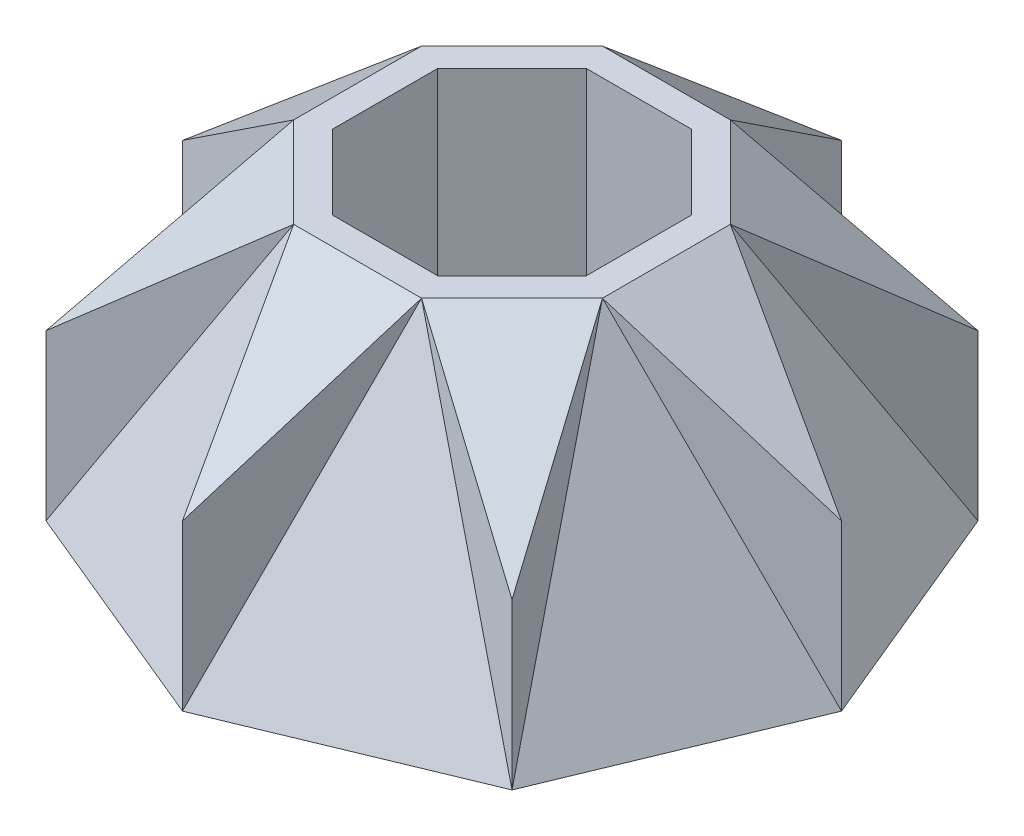
ISO-10303-21;
HEADER;
FILE_DESCRIPTION(('STEP AP214'),'2;1');
FILE_NAME('part.step','',(''),(''),'','','');
FILE_SCHEMA(('AUTOMOTIVE_DESIGN { 1 0 10303 214 1 1 1 1 }'));
ENDSEC;
DATA;
#1=APPLICATION_CONTEXT('core data for automotive mechanical design processes');
#2=APPLICATION_PROTOCOL_DEFINITION('international standard','automotive_design',2000,#1);
#3=PRODUCT_CONTEXT('',#1,'mechanical');
#4=PRODUCT('Part','Part','',(#3));
#5=PRODUCT_RELATED_PRODUCT_CATEGORY('part','',(#4));
#6=PRODUCT_DEFINITION_FORMATION('','',#4);
#7=PRODUCT_DEFINITION_CONTEXT('part definition',#1,'design');
#8=PRODUCT_DEFINITION('design','',#6,#7);
#9=PRODUCT_DEFINITION_SHAPE('','',#8);
#10=(LENGTH_UNIT() NAMED_UNIT(*) SI_UNIT(.MILLI.,.METRE.));
#11=(NAMED_UNIT(*) PLANE_ANGLE_UNIT() SI_UNIT($,.RADIAN.));
#12=(NAMED_UNIT(*) SI_UNIT($,.STERADIAN.) SOLID_ANGLE_UNIT());
#13=UNCERTAINTY_MEASURE_WITH_UNIT(LENGTH_MEASURE(1.E-05),#10,'distance_accuracy_value','');
#14=(GEOMETRIC_REPRESENTATION_CONTEXT(3) GLOBAL_UNCERTAINTY_ASSIGNED_CONTEXT((#13)) GLOBAL_UNIT_ASSIGNED_CONTEXT((#10,
#11,#12)) REPRESENTATION_CONTEXT('',''));
#15=CARTESIAN_POINT('',(0.,0.,0.));
#16=DIRECTION('',(0.,0.,1.));
#17=DIRECTION('',(1.,0.,0.));
#18=AXIS2_PLACEMENT_3D('',#15,#16,#17);
#19=CARTESIAN_POINT('',(0.,55.,0.));
#20=DIRECTION('',(0.,1.,0.));
#21=DIRECTION('',(0.,0.,1.));
#22=AXIS2_PLACEMENT_3D('',#19,#20,#21);
#23=PLANE('',#22);
#24=DIRECTION('',(1.,0.,0.));
#25=VECTOR('',#24,1.);
#26=CARTESIAN_POINT('',(-11.6443685579777,55.0000000000001,28.1119924979396));
#27=LINE('',#26,#25);
#28=CARTESIAN_POINT('',(-11.6443685579777,55.0000000000001,28.1119924979396));
#29=VERTEX_POINT('',#28);
#30=CARTESIAN_POINT('',(11.644368557977,55.,28.1119924979399));
#31=VERTEX_POINT('',#30);
#32=EDGE_CURVE('E176',#29,#31,#27,.T.);
#33=ORIENTED_EDGE('',*,*,#32,.T.);
#34=DIRECTION('',(0.707106781186555,0.,-0.70710678118654));
#35=VECTOR('',#34,1.);
#36=CARTESIAN_POINT('',(11.644368557977,55.0000000000001,28.1119924979399));
#37=LINE('',#36,#35);
#38=CARTESIAN_POINT('',(28.1119924979396,55.,11.6443685579776));
#39=VERTEX_POINT('',#38);
#40=EDGE_CURVE('E211',#31,#39,#37,.T.);
#41=ORIENTED_EDGE('',*,*,#40,.T.);
#42=DIRECTION('',(0.,0.,-1.));
#43=VECTOR('',#42,1.);
#44=CARTESIAN_POINT('',(28.1119924979397,55.0000000000001,11.6443685579774));
#45=LINE('',#44,#43);
#46=CARTESIAN_POINT('',(28.1119924979398,55.,-11.6443685579773));
#47=VERTEX_POINT('',#46);
#48=EDGE_CURVE('E193',#39,#47,#45,.T.);
#49=ORIENTED_EDGE('',*,*,#48,.T.);
#50=DIRECTION('',(-0.707106781186542,0.,-0.707106781186553));
#51=VECTOR('',#50,1.);
#52=CARTESIAN_POINT('',(28.1119924979399,55.0000000000001,-11.6443685579771));
#53=LINE('',#52,#51);
#54=CARTESIAN_POINT('',(11.6443685579776,55.,-28.1119924979397));
#55=VERTEX_POINT('',#54);
#56=EDGE_CURVE('E343',#47,#55,#53,.T.);
#57=ORIENTED_EDGE('',*,*,#56,.T.);
#58=DIRECTION('',(-1.,0.,0.));
#59=VECTOR('',#58,1.);
#60=CARTESIAN_POINT('',(11.6443685579775,55.0000000000001,-28.1119924979397));
#61=LINE('',#60,#59);
#62=CARTESIAN_POINT('',(-11.6443685579772,55.,-28.1119924979398));
#63=VERTEX_POINT('',#62);
#64=EDGE_CURVE('E341',#55,#63,#61,.T.);
#65=ORIENTED_EDGE('',*,*,#64,.T.);
#66=DIRECTION('',(-0.70710678118655,0.,0.707106781186545));
#67=VECTOR('',#66,1.);
#68=CARTESIAN_POINT('',(-11.6443685579772,55.0000000000001,-28.1119924979398));
#69=LINE('',#68,#67);
#70=CARTESIAN_POINT('',(-28.1119924979397,55.,-11.6443685579775));
#71=VERTEX_POINT('',#70);
#72=EDGE_CURVE('E335',#63,#71,#69,.T.);
#73=ORIENTED_EDGE('',*,*,#72,.T.);
#74=DIRECTION('',(0.,0.,1.));
#75=VECTOR('',#74,1.);
#76=CARTESIAN_POINT('',(-28.1119924979397,55.0000000000001,-11.6443685579774));
#77=LINE('',#76,#75);
#78=CARTESIAN_POINT('',(-28.1119924979398,55.,11.6443685579773));
#79=VERTEX_POINT('',#78);
#80=EDGE_CURVE('E204',#71,#79,#77,.T.);
#81=ORIENTED_EDGE('',*,*,#80,.T.);
#82=DIRECTION('',(0.707106781186538,0.,0.707106781186557));
#83=VECTOR('',#82,1.);
#84=CARTESIAN_POINT('',(-28.1119924979399,55.0000000000001,11.6443685579769));
#85=LINE('',#84,#83);
#86=EDGE_CURVE('E199',#79,#29,#85,.T.);
#87=ORIENTED_EDGE('',*,*,#86,.T.);
#88=EDGE_LOOP('',(#33,#41,#49,#57,#65,#73,#81,#87));
#89=FACE_BOUND('',#88,.T.);
#90=DIRECTION('',(0.,0.,-1.));
#91=VECTOR('',#90,1.);
#92=CARTESIAN_POINT('',(23.1119924979397,55.,9.57330074611187));
#93=LINE('',#92,#91);
#94=CARTESIAN_POINT('',(23.1119924979397,55.,9.57330074611187));
#95=VERTEX_POINT('',#94);
#96=CARTESIAN_POINT('',(23.1119924979397,55.,-9.57330074611187));
#97=VERTEX_POINT('',#96);
#98=EDGE_CURVE('E237',#95,#97,#93,.T.);
#99=ORIENTED_EDGE('',*,*,#98,.F.);
#100=DIRECTION('',(0.707106781186547,0.,-0.707106781186548));
#101=VECTOR('',#100,1.);
#102=CARTESIAN_POINT('',(9.57330074611187,55.,23.1119924979397));
#103=LINE('',#102,#101);
#104=CARTESIAN_POINT('',(9.57330074611187,55.,23.1119924979397));
#105=VERTEX_POINT('',#104);
#106=EDGE_CURVE('E235',#105,#95,#103,.T.);
#107=ORIENTED_EDGE('',*,*,#106,.F.);
#108=DIRECTION('',(1.,0.,0.));
#109=VECTOR('',#108,1.);
#110=CARTESIAN_POINT('',(-9.57330074611187,55.,23.1119924979397));
#111=LINE('',#110,#109);
#112=CARTESIAN_POINT('',(-9.57330074611187,55.,23.1119924979397));
#113=VERTEX_POINT('',#112);
#114=EDGE_CURVE('E251',#113,#105,#111,.T.);
#115=ORIENTED_EDGE('',*,*,#114,.F.);
#116=DIRECTION('',(0.707106781186547,0.,0.707106781186548));
#117=VECTOR('',#116,1.);
#118=CARTESIAN_POINT('',(-23.1119924979397,55.,9.57330074611187));
#119=LINE('',#118,#117);
#120=CARTESIAN_POINT('',(-23.1119924979397,55.,9.57330074611187));
#121=VERTEX_POINT('',#120);
#122=EDGE_CURVE('E248',#121,#113,#119,.T.);
#123=ORIENTED_EDGE('',*,*,#122,.F.);
#124=DIRECTION('',(0.,0.,1.));
#125=VECTOR('',#124,1.);
#126=CARTESIAN_POINT('',(-23.1119924979397,55.,-9.57330074611187));
#127=LINE('',#126,#125);
#128=CARTESIAN_POINT('',(-23.1119924979397,55.,-9.57330074611187));
#129=VERTEX_POINT('',#128);
#130=EDGE_CURVE('E246',#129,#121,#127,.T.);
#131=ORIENTED_EDGE('',*,*,#130,.F.);
#132=DIRECTION('',(-0.707106781186547,0.,0.707106781186547));
#133=VECTOR('',#132,1.);
#134=CARTESIAN_POINT('',(-9.57330074611187,55.,-23.1119924979397));
#135=LINE('',#134,#133);
#136=CARTESIAN_POINT('',(-9.57330074611187,55.,-23.1119924979397));
#137=VERTEX_POINT('',#136);
#138=EDGE_CURVE('E244',#137,#129,#135,.T.);
#139=ORIENTED_EDGE('',*,*,#138,.F.);
#140=DIRECTION('',(-1.,0.,0.));
#141=VECTOR('',#140,1.);
#142=CARTESIAN_POINT('',(9.57330074611187,55.,-23.1119924979397));
#143=LINE('',#142,#141);
#144=CARTESIAN_POINT('',(9.57330074611187,55.,-23.1119924979397));
#145=VERTEX_POINT('',#144);
#146=EDGE_CURVE('E242',#145,#137,#143,.T.);
#147=ORIENTED_EDGE('',*,*,#146,.F.);
#148=DIRECTION('',(-0.707106781186547,0.,-0.707106781186547));
#149=VECTOR('',#148,1.);
#150=CARTESIAN_POINT('',(23.1119924979397,55.,-9.57330074611187));
#151=LINE('',#150,#149);
#152=EDGE_CURVE('E240',#97,#145,#151,.T.);
#153=ORIENTED_EDGE('',*,*,#152,.F.);
#154=EDGE_LOOP('',(#99,#107,#115,#123,#131,#139,#147,#153));
#155=FACE_BOUND('',#154,.T.);
#156=ADVANCED_FACE('F41',(#89,#155),#23,.T.);
#157=CARTESIAN_POINT('',(0.,0.,0.));
#158=DIRECTION('',(0.,1.,0.));
#159=DIRECTION('',(0.,0.,1.));
#160=AXIS2_PLACEMENT_3D('',#157,#158,#159);
#161=PLANE('',#160);
#162=DIRECTION('',(0.923879532511287,0.,-0.38268343236509));
#163=VECTOR('',#162,1.);
#164=CARTESIAN_POINT('',(0.,0.,60.0000000000001));
#165=LINE('',#164,#163);
#166=CARTESIAN_POINT('',(-7.04297731246584E-13,0.,60.0000000000001));
#167=VERTEX_POINT('',#166);
#168=CARTESIAN_POINT('',(42.4264068711925,0.,42.4264068711934));
#169=VERTEX_POINT('',#168);
#170=EDGE_CURVE('E293',#167,#169,#165,.T.);
#171=ORIENTED_EDGE('',*,*,#170,.F.);
#172=DIRECTION('',(0.923879532511287,0.,0.38268343236509));
#173=VECTOR('',#172,1.);
#174=CARTESIAN_POINT('',(-42.4264068711929,0.,42.4264068711929));
#175=LINE('',#174,#173);
#176=CARTESIAN_POINT('',(-42.4264068711929,0.,42.4264068711929));
#177=VERTEX_POINT('',#176);
#178=EDGE_CURVE('E225',#177,#167,#175,.T.);
#179=ORIENTED_EDGE('',*,*,#178,.F.);
#180=DIRECTION('',(0.38268343236509,0.,0.923879532511287));
#181=VECTOR('',#180,1.);
#182=CARTESIAN_POINT('',(-60.0000000000001,0.,0.));
#183=LINE('',#182,#181);
#184=CARTESIAN_POINT('',(-60.0000000000001,0.,-1.99080539474728E-13));
#185=VERTEX_POINT('',#184);
#186=EDGE_CURVE('E311',#185,#177,#183,.T.);
#187=ORIENTED_EDGE('',*,*,#186,.F.);
#188=DIRECTION('',(-0.38268343236509,0.,0.923879532511287));
#189=VECTOR('',#188,1.);
#190=CARTESIAN_POINT('',(-42.4264068711929,0.,-42.4264068711929));
#191=LINE('',#190,#189);
#192=CARTESIAN_POINT('',(-42.4264068711928,0.,-42.4264068711931));
#193=VERTEX_POINT('',#192);
#194=EDGE_CURVE('E308',#193,#185,#191,.T.);
#195=ORIENTED_EDGE('',*,*,#194,.F.);
#196=DIRECTION('',(-0.923879532511287,0.,0.38268343236509));
#197=VECTOR('',#196,1.);
#198=CARTESIAN_POINT('',(0.,0.,-60.0000000000001));
#199=LINE('',#198,#197);
#200=CARTESIAN_POINT('',(0.,0.,-60.0000000000001));
#201=VERTEX_POINT('',#200);
#202=EDGE_CURVE('E305',#201,#193,#199,.T.);
#203=ORIENTED_EDGE('',*,*,#202,.F.);
#204=DIRECTION('',(-0.923879532511287,0.,-0.38268343236509));
#205=VECTOR('',#204,1.);
#206=CARTESIAN_POINT('',(42.4264068711929,0.,-42.4264068711929));
#207=LINE('',#206,#205);
#208=CARTESIAN_POINT('',(42.4264068711929,0.,-42.4264068711929));
#209=VERTEX_POINT('',#208);
#210=EDGE_CURVE('E302',#209,#201,#207,.T.);
#211=ORIENTED_EDGE('',*,*,#210,.F.);
#212=DIRECTION('',(-0.38268343236509,0.,-0.923879532511287));
#213=VECTOR('',#212,1.);
#214=CARTESIAN_POINT('',(60.0000000000001,0.,0.));
#215=LINE('',#214,#213);
#216=CARTESIAN_POINT('',(60.0000000000001,0.,4.96130914129367E-13));
#217=VERTEX_POINT('',#216);
#218=EDGE_CURVE('E299',#217,#209,#215,.T.);
#219=ORIENTED_EDGE('',*,*,#218,.F.);
#220=DIRECTION('',(0.38268343236509,0.,-0.923879532511287));
#221=VECTOR('',#220,1.);
#222=CARTESIAN_POINT('',(42.4264068711929,0.,42.4264068711929));
#223=LINE('',#222,#221);
#224=EDGE_CURVE('E296',#169,#217,#223,.T.);
#225=ORIENTED_EDGE('',*,*,#224,.F.);
#226=EDGE_LOOP('',(#171,#179,#187,#195,#203,#211,#219,#225));
#227=FACE_BOUND('',#226,.T.);
#228=DIRECTION('',(0.707106781186547,0.,-0.707106781186548));
#229=VECTOR('',#228,1.);
#230=CARTESIAN_POINT('',(9.57330074611187,0.,23.1119924979397));
#231=LINE('',#230,#229);
#232=CARTESIAN_POINT('',(9.57330074611187,0.,23.1119924979397));
#233=VERTEX_POINT('',#232);
#234=CARTESIAN_POINT('',(23.1119924979397,0.,9.57330074611187));
#235=VERTEX_POINT('',#234);
#236=EDGE_CURVE('E222',#233,#235,#231,.T.);
#237=ORIENTED_EDGE('',*,*,#236,.T.);
#238=DIRECTION('',(0.,0.,-1.));
#239=VECTOR('',#238,1.);
#240=CARTESIAN_POINT('',(23.1119924979397,0.,9.57330074611187));
#241=LINE('',#240,#239);
#242=CARTESIAN_POINT('',(23.1119924979397,0.,-9.57330074611187));
#243=VERTEX_POINT('',#242);
#244=EDGE_CURVE('E256',#235,#243,#241,.T.);
#245=ORIENTED_EDGE('',*,*,#244,.T.);
#246=DIRECTION('',(-0.707106781186547,0.,-0.707106781186547));
#247=VECTOR('',#246,1.);
#248=CARTESIAN_POINT('',(23.1119924979397,0.,-9.57330074611187));
#249=LINE('',#248,#247);
#250=CARTESIAN_POINT('',(9.57330074611187,0.,-23.1119924979397));
#251=VERTEX_POINT('',#250);
#252=EDGE_CURVE('E259',#243,#251,#249,.T.);
#253=ORIENTED_EDGE('',*,*,#252,.T.);
#254=DIRECTION('',(-1.,0.,0.));
#255=VECTOR('',#254,1.);
#256=CARTESIAN_POINT('',(9.57330074611187,0.,-23.1119924979397));
#257=LINE('',#256,#255);
#258=CARTESIAN_POINT('',(-9.57330074611187,0.,-23.1119924979397));
#259=VERTEX_POINT('',#258);
#260=EDGE_CURVE('E262',#251,#259,#257,.T.);
#261=ORIENTED_EDGE('',*,*,#260,.T.);
#262=DIRECTION('',(-0.707106781186547,0.,0.707106781186547));
#263=VECTOR('',#262,1.);
#264=CARTESIAN_POINT('',(-9.57330074611187,0.,-23.1119924979397));
#265=LINE('',#264,#263);
#266=CARTESIAN_POINT('',(-23.1119924979397,0.,-9.57330074611187));
#267=VERTEX_POINT('',#266);
#268=EDGE_CURVE('E265',#259,#267,#265,.T.);
#269=ORIENTED_EDGE('',*,*,#268,.T.);
#270=DIRECTION('',(0.,0.,1.));
#271=VECTOR('',#270,1.);
#272=CARTESIAN_POINT('',(-23.1119924979397,0.,-9.57330074611187));
#273=LINE('',#272,#271);
#274=CARTESIAN_POINT('',(-23.1119924979397,0.,9.57330074611187));
#275=VERTEX_POINT('',#274);
#276=EDGE_CURVE('E268',#267,#275,#273,.T.);
#277=ORIENTED_EDGE('',*,*,#276,.T.);
#278=DIRECTION('',(0.707106781186547,0.,0.707106781186548));
#279=VECTOR('',#278,1.);
#280=CARTESIAN_POINT('',(-23.1119924979397,0.,9.57330074611187));
#281=LINE('',#280,#279);
#282=CARTESIAN_POINT('',(-9.57330074611187,0.,23.1119924979397));
#283=VERTEX_POINT('',#282);
#284=EDGE_CURVE('E271',#275,#283,#281,.T.);
#285=ORIENTED_EDGE('',*,*,#284,.T.);
#286=DIRECTION('',(1.,0.,0.));
#287=VECTOR('',#286,1.);
#288=CARTESIAN_POINT('',(-9.57330074611187,0.,23.1119924979397));
#289=LINE('',#288,#287);
#290=EDGE_CURVE('E238',#283,#233,#289,.T.);
#291=ORIENTED_EDGE('',*,*,#290,.T.);
#292=EDGE_LOOP('',(#237,#245,#253,#261,#269,#277,#285,#291));
#293=FACE_BOUND('',#292,.T.);
#294=ADVANCED_FACE('F43',(#227,#293),#161,.F.);
#295=CARTESIAN_POINT('',(9.57330074611187,55.,23.1119924979397));
#296=DIRECTION('',(-0.707106781186548,0.,-0.707106781186547));
#297=DIRECTION('',(-0.707106781186547,0.,0.707106781186548));
#298=AXIS2_PLACEMENT_3D('',#295,#296,#297);
#299=PLANE('',#298);
#300=ORIENTED_EDGE('',*,*,#236,.F.);
#301=DIRECTION('',(0.,-1.,0.));
#302=VECTOR('',#301,1.);
#303=CARTESIAN_POINT('',(9.57330074611187,55.,23.1119924979397));
#304=LINE('',#303,#302);
#305=EDGE_CURVE('E253',#105,#233,#304,.T.);
#306=ORIENTED_EDGE('',*,*,#305,.F.);
#307=ORIENTED_EDGE('',*,*,#106,.T.);
#308=DIRECTION('',(0.,-1.,0.));
#309=VECTOR('',#308,1.);
#310=CARTESIAN_POINT('',(23.1119924979397,55.,9.57330074611187));
#311=LINE('',#310,#309);
#312=EDGE_CURVE('E290',#95,#235,#311,.T.);
#313=ORIENTED_EDGE('',*,*,#312,.T.);
#314=EDGE_LOOP('',(#300,#306,#307,#313));
#315=FACE_BOUND('',#314,.T.);
#316=ADVANCED_FACE('F488',(#315),#299,.T.);
#317=CARTESIAN_POINT('',(23.1119924979397,55.,9.57330074611187));
#318=DIRECTION('',(-1.,0.,0.));
#319=DIRECTION('',(0.,0.,1.));
#320=AXIS2_PLACEMENT_3D('',#317,#318,#319);
#321=PLANE('',#320);
#322=ORIENTED_EDGE('',*,*,#244,.F.);
#323=ORIENTED_EDGE('',*,*,#312,.F.);
#324=ORIENTED_EDGE('',*,*,#98,.T.);
#325=DIRECTION('',(0.,-1.,0.));
#326=VECTOR('',#325,1.);
#327=CARTESIAN_POINT('',(23.1119924979397,55.,-9.57330074611187));
#328=LINE('',#327,#326);
#329=EDGE_CURVE('E288',#97,#243,#328,.T.);
#330=ORIENTED_EDGE('',*,*,#329,.T.);
#331=EDGE_LOOP('',(#322,#323,#324,#330));
#332=FACE_BOUND('',#331,.T.);
#333=ADVANCED_FACE('F492',(#332),#321,.T.);
#334=CARTESIAN_POINT('',(23.1119924979397,55.,-9.57330074611187));
#335=DIRECTION('',(-0.707106781186547,0.,0.707106781186547));
#336=DIRECTION('',(0.707106781186548,0.,0.707106781186548));
#337=AXIS2_PLACEMENT_3D('',#334,#335,#336);
#338=PLANE('',#337);
#339=ORIENTED_EDGE('',*,*,#252,.F.);
#340=ORIENTED_EDGE('',*,*,#329,.F.);
#341=ORIENTED_EDGE('',*,*,#152,.T.);
#342=DIRECTION('',(0.,-1.,0.));
#343=VECTOR('',#342,1.);
#344=CARTESIAN_POINT('',(9.57330074611187,55.,-23.1119924979397));
#345=LINE('',#344,#343);
#346=EDGE_CURVE('E286',#145,#251,#345,.T.);
#347=ORIENTED_EDGE('',*,*,#346,.T.);
#348=EDGE_LOOP('',(#339,#340,#341,#347));
#349=FACE_BOUND('',#348,.T.);
#350=ADVANCED_FACE('F496',(#349),#338,.T.);
#351=CARTESIAN_POINT('',(9.57330074611187,55.,-23.1119924979397));
#352=DIRECTION('',(0.,0.,1.));
#353=DIRECTION('',(1.,0.,0.));
#354=AXIS2_PLACEMENT_3D('',#351,#352,#353);
#355=PLANE('',#354);
#356=ORIENTED_EDGE('',*,*,#260,.F.);
#357=ORIENTED_EDGE('',*,*,#346,.F.);
#358=ORIENTED_EDGE('',*,*,#146,.T.);
#359=DIRECTION('',(0.,-1.,0.));
#360=VECTOR('',#359,1.);
#361=CARTESIAN_POINT('',(-9.57330074611187,55.,-23.1119924979397));
#362=LINE('',#361,#360);
#363=EDGE_CURVE('E284',#137,#259,#362,.T.);
#364=ORIENTED_EDGE('',*,*,#363,.T.);
#365=EDGE_LOOP('',(#356,#357,#358,#364));
#366=FACE_BOUND('',#365,.T.);
#367=ADVANCED_FACE('F500',(#366),#355,.T.);
#368=CARTESIAN_POINT('',(-9.57330074611187,55.,-23.1119924979397));
#369=DIRECTION('',(0.707106781186547,0.,0.707106781186547));
#370=DIRECTION('',(0.707106781186548,0.,-0.707106781186548));
#371=AXIS2_PLACEMENT_3D('',#368,#369,#370);
#372=PLANE('',#371);
#373=ORIENTED_EDGE('',*,*,#268,.F.);
#374=ORIENTED_EDGE('',*,*,#363,.F.);
#375=ORIENTED_EDGE('',*,*,#138,.T.);
#376=DIRECTION('',(0.,-1.,0.));
#377=VECTOR('',#376,1.);
#378=CARTESIAN_POINT('',(-23.1119924979397,55.,-9.57330074611187));
#379=LINE('',#378,#377);
#380=EDGE_CURVE('E282',#129,#267,#379,.T.);
#381=ORIENTED_EDGE('',*,*,#380,.T.);
#382=EDGE_LOOP('',(#373,#374,#375,#381));
#383=FACE_BOUND('',#382,.T.);
#384=ADVANCED_FACE('F504',(#383),#372,.T.);
#385=CARTESIAN_POINT('',(-23.1119924979397,55.,-9.57330074611187));
#386=DIRECTION('',(1.,0.,0.));
#387=DIRECTION('',(0.,0.,-1.));
#388=AXIS2_PLACEMENT_3D('',#385,#386,#387);
#389=PLANE('',#388);
#390=ORIENTED_EDGE('',*,*,#276,.F.);
#391=ORIENTED_EDGE('',*,*,#380,.F.);
#392=ORIENTED_EDGE('',*,*,#130,.T.);
#393=DIRECTION('',(0.,-1.,0.));
#394=VECTOR('',#393,1.);
#395=CARTESIAN_POINT('',(-23.1119924979397,55.,9.57330074611187));
#396=LINE('',#395,#394);
#397=EDGE_CURVE('E280',#121,#275,#396,.T.);
#398=ORIENTED_EDGE('',*,*,#397,.T.);
#399=EDGE_LOOP('',(#390,#391,#392,#398));
#400=FACE_BOUND('',#399,.T.);
#401=ADVANCED_FACE('F508',(#400),#389,.T.);
#402=CARTESIAN_POINT('',(-23.1119924979397,55.,9.57330074611187));
#403=DIRECTION('',(0.707106781186548,0.,-0.707106781186547));
#404=DIRECTION('',(-0.707106781186547,0.,-0.707106781186548));
#405=AXIS2_PLACEMENT_3D('',#402,#403,#404);
#406=PLANE('',#405);
#407=ORIENTED_EDGE('',*,*,#284,.F.);
#408=ORIENTED_EDGE('',*,*,#397,.F.);
#409=ORIENTED_EDGE('',*,*,#122,.T.);
#410=DIRECTION('',(0.,-1.,0.));
#411=VECTOR('',#410,1.);
#412=CARTESIAN_POINT('',(-9.57330074611187,55.,23.1119924979397));
#413=LINE('',#412,#411);
#414=EDGE_CURVE('E278',#113,#283,#413,.T.);
#415=ORIENTED_EDGE('',*,*,#414,.T.);
#416=EDGE_LOOP('',(#407,#408,#409,#415));
#417=FACE_BOUND('',#416,.T.);
#418=ADVANCED_FACE('F512',(#417),#406,.T.);
#419=CARTESIAN_POINT('',(-9.57330074611187,55.,23.1119924979397));
#420=DIRECTION('',(0.,0.,-1.));
#421=DIRECTION('',(-1.,0.,0.));
#422=AXIS2_PLACEMENT_3D('',#419,#420,#421);
#423=PLANE('',#422);
#424=ORIENTED_EDGE('',*,*,#290,.F.);
#425=ORIENTED_EDGE('',*,*,#414,.F.);
#426=ORIENTED_EDGE('',*,*,#114,.T.);
#427=ORIENTED_EDGE('',*,*,#305,.T.);
#428=EDGE_LOOP('',(#424,#425,#426,#427));
#429=FACE_BOUND('',#428,.T.);
#430=ADVANCED_FACE('F516',(#429),#423,.T.);
#431=CARTESIAN_POINT('',(0.,55.,60.0000000000001));
#432=DIRECTION('',(-0.939331553105123,0.,0.343010544066969));
#433=DIRECTION('',(0.343010544066969,0.,0.939331553105123));
#434=AXIS2_PLACEMENT_3D('',#431,#432,#433);
#435=PLANE('',#434);
#436=DIRECTION('',(0.276196973357169,-0.592984007638504,0.756363139367141));
#437=VECTOR('',#436,1.);
#438=CARTESIAN_POINT('',(-4.09450970397397,38.7907508328756,48.7872188597009));
#439=LINE('',#438,#437);
#440=CARTESIAN_POINT('',(-3.05311331771918E-13,30.0000000000002,60.));
#441=VERTEX_POINT('',#440);
#442=EDGE_CURVE('E56',#29,#441,#439,.T.);
#443=ORIENTED_EDGE('',*,*,#442,.F.);
#444=DIRECTION('',(-0.180161099090728,0.850957301862593,-0.493369687740498));
#445=VECTOR('',#444,1.);
#446=CARTESIAN_POINT('',(0.,0.,60.0000000000001));
#447=LINE('',#446,#445);
#448=EDGE_CURVE('E190',#167,#29,#447,.T.);
#449=ORIENTED_EDGE('',*,*,#448,.F.);
#450=DIRECTION('',(0.,-1.,0.));
#451=VECTOR('',#450,1.);
#452=CARTESIAN_POINT('',(0.,55.,60.0000000000001));
#453=LINE('',#452,#451);
#454=EDGE_CURVE('E192',#441,#167,#453,.T.);
#455=ORIENTED_EDGE('',*,*,#454,.F.);
#456=EDGE_LOOP('',(#443,#449,#455));
#457=FACE_BOUND('',#456,.T.);
#458=ADVANCED_FACE('F188',(#457),#435,.T.);
#459=CARTESIAN_POINT('',(-11.6443685579773,110.,28.1119924979398));
#460=DIRECTION('',(0.421662629254883,0.,0.906752792711364));
#461=DIRECTION('',(0.906752792711365,0.,-0.421662629254883));
#462=AXIS2_PLACEMENT_3D('',#459,#460,#461);
#463=PLANE('',#462);
#464=DIRECTION('',(0.730130257690103,0.592984007638508,-0.339528752081996));
#465=VECTOR('',#464,1.);
#466=CARTESIAN_POINT('',(12.1681875886994,74.3396518323265,17.0385608914452));
#467=LINE('',#466,#465);
#468=CARTESIAN_POINT('',(-42.426406871193,30.,42.4264068711929));
#469=VERTEX_POINT('',#468);
#470=EDGE_CURVE('E197',#469,#29,#467,.T.);
#471=ORIENTED_EDGE('',*,*,#470,.F.);
#472=DIRECTION('',(0.,-1.,0.));
#473=VECTOR('',#472,1.);
#474=CARTESIAN_POINT('',(-42.4264068711929,55.,42.4264068711929));
#475=LINE('',#474,#473);
#476=EDGE_CURVE('E217',#469,#177,#475,.T.);
#477=ORIENTED_EDGE('',*,*,#476,.T.);
#478=DIRECTION('',(-0.476258186706271,-0.850957301862593,0.221471916960121));
#479=VECTOR('',#478,1.);
#480=CARTESIAN_POINT('',(-11.6443685579773,55.,28.1119924979398));
#481=LINE('',#480,#479);
#482=EDGE_CURVE('E215',#29,#177,#481,.T.);
#483=ORIENTED_EDGE('',*,*,#482,.F.);
#484=EDGE_LOOP('',(#471,#477,#483));
#485=FACE_BOUND('',#484,.T.);
#486=ADVANCED_FACE('F216',(#485),#463,.T.);
#487=CARTESIAN_POINT('',(-17.5797048196039,20.884718613654,42.4411617980033));
#488=DIRECTION('',(0.348371261702119,-0.413865639292134,-0.841042624742282));
#489=DIRECTION('',(0.,0.897249341369732,-0.441524200255866));
#490=AXIS2_PLACEMENT_3D('',#487,#488,#489);
#491=PLANE('',#490);
#492=ORIENTED_EDGE('',*,*,#448,.T.);
#493=ORIENTED_EDGE('',*,*,#482,.T.);
#494=ORIENTED_EDGE('',*,*,#178,.T.);
#495=EDGE_LOOP('',(#492,#493,#494));
#496=FACE_BOUND('',#495,.T.);
#497=ADVANCED_FACE('F224',(#496),#491,.F.);
#498=CARTESIAN_POINT('',(-42.426406871193,55.,42.4264068711929));
#499=DIRECTION('',(-0.906752792711364,0.,-0.421662629254884));
#500=DIRECTION('',(-0.421662629254884,0.,0.906752792711364));
#501=AXIS2_PLACEMENT_3D('',#498,#499,#500);
#502=PLANE('',#501);
#503=DIRECTION('',(-0.339528752081998,-0.592984007638504,0.730130257690105));
#504=VECTOR('',#503,1.);
#505=CARTESIAN_POINT('',(-37.3930288682409,38.7907508328756,31.6025177136126));
#506=LINE('',#505,#504);
#507=EDGE_CURVE('E11',#79,#469,#506,.T.);
#508=ORIENTED_EDGE('',*,*,#507,.F.);
#509=DIRECTION('',(0.221471916960122,0.850957301862593,-0.476258186706271));
#510=VECTOR('',#509,1.);
#511=CARTESIAN_POINT('',(-42.426406871193,0.,42.4264068711929));
#512=LINE('',#511,#510);
#513=EDGE_CURVE('E229',#177,#79,#512,.T.);
#514=ORIENTED_EDGE('',*,*,#513,.F.);
#515=ORIENTED_EDGE('',*,*,#476,.F.);
#516=EDGE_LOOP('',(#508,#514,#515));
#517=FACE_BOUND('',#516,.T.);
#518=ADVANCED_FACE('F526',(#517),#502,.T.);
#519=CARTESIAN_POINT('',(-28.1119924979398,110.,11.6443685579773));
#520=DIRECTION('',(-0.34301054406697,0.,0.939331553105122));
#521=DIRECTION('',(0.939331553105122,0.,0.34301054406697));
#522=AXIS2_PLACEMENT_3D('',#519,#520,#521);
#523=PLANE('',#522);
#524=DIRECTION('',(0.75636313936714,0.592984007638506,0.27619697335717));
#525=VECTOR('',#524,1.);
#526=CARTESIAN_POINT('',(-3.44387398928151,74.3396518323263,20.6522899067201));
#527=LINE('',#526,#525);
#528=CARTESIAN_POINT('',(-60.0000000000001,30.,-1.99493199737333E-13));
#529=VERTEX_POINT('',#528);
#530=EDGE_CURVE('E351',#529,#79,#527,.T.);
#531=ORIENTED_EDGE('',*,*,#530,.F.);
#532=DIRECTION('',(0.,-1.,0.));
#533=VECTOR('',#532,1.);
#534=CARTESIAN_POINT('',(-60.0000000000001,55.,0.));
#535=LINE('',#534,#533);
#536=EDGE_CURVE('E317',#529,#185,#535,.T.);
#537=ORIENTED_EDGE('',*,*,#536,.T.);
#538=DIRECTION('',(-0.493369687740498,-0.850957301862593,-0.180161099090728));
#539=VECTOR('',#538,1.);
#540=CARTESIAN_POINT('',(-28.1119924979398,55.,11.6443685579773));
#541=LINE('',#540,#539);
#542=EDGE_CURVE('E226',#79,#185,#541,.T.);
#543=ORIENTED_EDGE('',*,*,#542,.F.);
#544=EDGE_LOOP('',(#531,#537,#543));
#545=FACE_BOUND('',#544,.T.);
#546=ADVANCED_FACE('F544',(#545),#523,.T.);
#547=CARTESIAN_POINT('',(-42.4411617980033,20.884718613654,17.5797048196038));
#548=DIRECTION('',(0.841042624742283,-0.413865639292134,-0.348371261702117));
#549=DIRECTION('',(0.312204756058891,0.897249341369732,-0.312204756058889));
#550=AXIS2_PLACEMENT_3D('',#547,#548,#549);
#551=PLANE('',#550);
#552=ORIENTED_EDGE('',*,*,#513,.T.);
#553=ORIENTED_EDGE('',*,*,#542,.T.);
#554=ORIENTED_EDGE('',*,*,#186,.T.);
#555=EDGE_LOOP('',(#552,#553,#554));
#556=FACE_BOUND('',#555,.T.);
#557=ADVANCED_FACE('F548',(#556),#551,.F.);
#558=CARTESIAN_POINT('',(42.4264068711924,55.,42.4264068711934));
#559=DIRECTION('',(-0.421662629254894,0.,0.90675279271136));
#560=DIRECTION('',(0.90675279271136,0.,0.421662629254894));
#561=AXIS2_PLACEMENT_3D('',#558,#559,#560);
#562=PLANE('',#561);
#563=DIRECTION('',(0.7301302576901,-0.592984007638506,0.339528752082005));
#564=VECTOR('',#563,1.);
#565=CARTESIAN_POINT('',(31.6025177136122,38.7907508328756,37.3930288682413));
#566=LINE('',#565,#564);
#567=CARTESIAN_POINT('',(42.4264068711927,30.0000000000002,42.426406871193));
#568=VERTEX_POINT('',#567);
#569=EDGE_CURVE('E342',#31,#568,#566,.T.);
#570=ORIENTED_EDGE('',*,*,#569,.F.);
#571=DIRECTION('',(-0.476258186706268,0.850957301862593,-0.221471916960127));
#572=VECTOR('',#571,1.);
#573=CARTESIAN_POINT('',(42.4264068711924,0.,42.4264068711934));
#574=LINE('',#573,#572);
#575=EDGE_CURVE('E365',#169,#31,#574,.T.);
#576=ORIENTED_EDGE('',*,*,#575,.F.);
#577=DIRECTION('',(0.,-1.,0.));
#578=VECTOR('',#577,1.);
#579=CARTESIAN_POINT('',(42.4264068711929,55.,42.4264068711929));
#580=LINE('',#579,#578);
#581=EDGE_CURVE('E327',#568,#169,#580,.T.);
#582=ORIENTED_EDGE('',*,*,#581,.F.);
#583=EDGE_LOOP('',(#570,#576,#582));
#584=FACE_BOUND('',#583,.T.);
#585=ADVANCED_FACE('F449',(#584),#562,.T.);
#586=CARTESIAN_POINT('',(11.644368557977,110.,28.1119924979399));
#587=DIRECTION('',(0.939331553105119,0.,0.34301054406698));
#588=DIRECTION('',(0.34301054406698,0.,-0.939331553105119));
#589=AXIS2_PLACEMENT_3D('',#586,#587,#588);
#590=PLANE('',#589);
#591=DIRECTION('',(0.276196973357178,0.592984007638506,-0.756363139367137));
#592=VECTOR('',#591,1.);
#593=CARTESIAN_POINT('',(20.6522899067201,74.3396518323263,3.44387398928172));
#594=LINE('',#593,#592);
#595=EDGE_CURVE('E178',#441,#31,#594,.T.);
#596=ORIENTED_EDGE('',*,*,#595,.F.);
#597=ORIENTED_EDGE('',*,*,#454,.T.);
#598=DIRECTION('',(-0.180161099090733,-0.850957301862593,0.493369687740496));
#599=VECTOR('',#598,1.);
#600=CARTESIAN_POINT('',(11.644368557977,55.,28.1119924979399));
#601=LINE('',#600,#599);
#602=EDGE_CURVE('E378',#31,#167,#601,.T.);
#603=ORIENTED_EDGE('',*,*,#602,.F.);
#604=EDGE_LOOP('',(#596,#597,#603));
#605=FACE_BOUND('',#604,.T.);
#606=ADVANCED_FACE('F452',(#605),#590,.T.);
#607=CARTESIAN_POINT('',(17.5797048196033,20.884718613654,42.4411617980035));
#608=DIRECTION('',(-0.348371261702109,-0.413865639292134,-0.841042624742286));
#609=DIRECTION('',(-0.312204756058886,0.897249341369732,-0.312204756058894));
#610=AXIS2_PLACEMENT_3D('',#607,#608,#609);
#611=PLANE('',#610);
#612=ORIENTED_EDGE('',*,*,#575,.T.);
#613=ORIENTED_EDGE('',*,*,#602,.T.);
#614=ORIENTED_EDGE('',*,*,#170,.T.);
#615=EDGE_LOOP('',(#612,#613,#614));
#616=FACE_BOUND('',#615,.T.);
#617=ADVANCED_FACE('F444',(#616),#611,.F.);
#618=CARTESIAN_POINT('',(-42.4264068711927,55.,-42.4264068711932));
#619=DIRECTION('',(0.421662629254888,0.,-0.906752792711363));
#620=DIRECTION('',(-0.906752792711363,0.,-0.421662629254888));
#621=AXIS2_PLACEMENT_3D('',#618,#619,#620);
#622=PLANE('',#621);
#623=DIRECTION('',(-0.730130257690103,-0.592984007638506,-0.339528752082));
#624=VECTOR('',#623,1.);
#625=CARTESIAN_POINT('',(-31.6025177136124,38.7907508328757,-37.393028868241));
#626=LINE('',#625,#624);
#627=CARTESIAN_POINT('',(-42.4264068711928,30.0000000000001,-42.426406871193));
#628=VERTEX_POINT('',#627);
#629=EDGE_CURVE('E64',#63,#628,#626,.T.);
#630=ORIENTED_EDGE('',*,*,#629,.F.);
#631=DIRECTION('',(0.47625818670627,0.850957301862593,0.221471916960123));
#632=VECTOR('',#631,1.);
#633=CARTESIAN_POINT('',(-42.4264068711927,0.,-42.4264068711932));
#634=LINE('',#633,#632);
#635=EDGE_CURVE('E385',#193,#63,#634,.T.);
#636=ORIENTED_EDGE('',*,*,#635,.F.);
#637=DIRECTION('',(0.,-1.,0.));
#638=VECTOR('',#637,1.);
#639=CARTESIAN_POINT('',(-42.4264068711929,55.,-42.4264068711929));
#640=LINE('',#639,#638);
#641=EDGE_CURVE('E319',#628,#193,#640,.T.);
#642=ORIENTED_EDGE('',*,*,#641,.F.);
#643=EDGE_LOOP('',(#630,#636,#642));
#644=FACE_BOUND('',#643,.T.);
#645=ADVANCED_FACE('F534',(#644),#622,.T.);
#646=CARTESIAN_POINT('',(-11.6443685579772,110.,-28.1119924979398));
#647=DIRECTION('',(-0.939331553105121,0.,-0.343010544066974));
#648=DIRECTION('',(-0.343010544066974,0.,0.939331553105121));
#649=AXIS2_PLACEMENT_3D('',#646,#647,#648);
#650=PLANE('',#649);
#651=DIRECTION('',(-0.276196973357172,0.592984007638506,0.756363139367139));
#652=VECTOR('',#651,1.);
#653=CARTESIAN_POINT('',(-20.6522899067201,74.3396518323263,-3.44387398928158));
#654=LINE('',#653,#652);
#655=CARTESIAN_POINT('',(0.,30.,-60.0000000000001));
#656=VERTEX_POINT('',#655);
#657=EDGE_CURVE('E212',#656,#63,#654,.T.);
#658=ORIENTED_EDGE('',*,*,#657,.F.);
#659=DIRECTION('',(0.,-1.,0.));
#660=VECTOR('',#659,1.);
#661=CARTESIAN_POINT('',(0.,55.,-60.0000000000001));
#662=LINE('',#661,#660);
#663=EDGE_CURVE('E321',#656,#201,#662,.T.);
#664=ORIENTED_EDGE('',*,*,#663,.T.);
#665=DIRECTION('',(0.18016109909073,-0.850957301862593,-0.493369687740497));
#666=VECTOR('',#665,1.);
#667=CARTESIAN_POINT('',(-11.6443685579772,55.,-28.1119924979398));
#668=LINE('',#667,#666);
#669=EDGE_CURVE('E383',#63,#201,#668,.T.);
#670=ORIENTED_EDGE('',*,*,#669,.F.);
#671=EDGE_LOOP('',(#658,#664,#670));
#672=FACE_BOUND('',#671,.T.);
#673=ADVANCED_FACE('F419',(#672),#650,.T.);
#674=CARTESIAN_POINT('',(-17.5797048196036,20.884718613654,-42.4411617980034));
#675=DIRECTION('',(0.348371261702114,-0.413865639292134,0.841042624742284));
#676=DIRECTION('',(0.312204756058888,0.897249341369732,0.312204756058892));
#677=AXIS2_PLACEMENT_3D('',#674,#675,#676);
#678=PLANE('',#677);
#679=ORIENTED_EDGE('',*,*,#635,.T.);
#680=ORIENTED_EDGE('',*,*,#669,.T.);
#681=ORIENTED_EDGE('',*,*,#202,.T.);
#682=EDGE_LOOP('',(#679,#680,#681));
#683=FACE_BOUND('',#682,.T.);
#684=ADVANCED_FACE('F416',(#683),#678,.F.);
#685=CARTESIAN_POINT('',(42.4264068711933,55.,-42.4264068711926));
#686=DIRECTION('',(0.906752792711361,0.,0.421662629254891));
#687=DIRECTION('',(0.421662629254891,0.,-0.906752792711361));
#688=AXIS2_PLACEMENT_3D('',#685,#686,#687);
#689=PLANE('',#688);
#690=DIRECTION('',(0.339528752082002,-0.592984007638506,-0.730130257690102));
#691=VECTOR('',#690,1.);
#692=CARTESIAN_POINT('',(37.3930288682411,38.7907508328756,-31.6025177136123));
#693=LINE('',#692,#691);
#694=CARTESIAN_POINT('',(42.4264068711929,30.0000000000001,-42.4264068711929));
#695=VERTEX_POINT('',#694);
#696=EDGE_CURVE('E428',#47,#695,#693,.T.);
#697=ORIENTED_EDGE('',*,*,#696,.F.);
#698=DIRECTION('',(-0.221471916960125,0.850957301862593,0.476258186706269));
#699=VECTOR('',#698,1.);
#700=CARTESIAN_POINT('',(42.4264068711933,0.,-42.4264068711926));
#701=LINE('',#700,#699);
#702=EDGE_CURVE('E381',#209,#47,#701,.T.);
#703=ORIENTED_EDGE('',*,*,#702,.F.);
#704=DIRECTION('',(0.,-1.,0.));
#705=VECTOR('',#704,1.);
#706=CARTESIAN_POINT('',(42.4264068711929,55.,-42.4264068711929));
#707=LINE('',#706,#705);
#708=EDGE_CURVE('E323',#695,#209,#707,.T.);
#709=ORIENTED_EDGE('',*,*,#708,.F.);
#710=EDGE_LOOP('',(#697,#703,#709));
#711=FACE_BOUND('',#710,.T.);
#712=ADVANCED_FACE('F471',(#711),#689,.T.);
#713=CARTESIAN_POINT('',(28.1119924979398,110.,-11.6443685579771));
#714=DIRECTION('',(0.343010544066977,0.,-0.93933155310512));
#715=DIRECTION('',(-0.93933155310512,0.,-0.343010544066977));
#716=AXIS2_PLACEMENT_3D('',#713,#714,#715);
#717=PLANE('',#716);
#718=DIRECTION('',(-0.756363139367139,0.592984007638505,-0.276196973357175));
#719=VECTOR('',#718,1.);
#720=CARTESIAN_POINT('',(3.44387398928164,74.3396518323262,-20.6522899067201));
#721=LINE('',#720,#719);
#722=CARTESIAN_POINT('',(60.0000000000001,30.,6.17561557447743E-13));
#723=VERTEX_POINT('',#722);
#724=EDGE_CURVE('E459',#723,#47,#721,.T.);
#725=ORIENTED_EDGE('',*,*,#724,.F.);
#726=DIRECTION('',(0.,-1.,0.));
#727=VECTOR('',#726,1.);
#728=CARTESIAN_POINT('',(60.0000000000001,55.,0.));
#729=LINE('',#728,#727);
#730=EDGE_CURVE('E325',#723,#217,#729,.T.);
#731=ORIENTED_EDGE('',*,*,#730,.T.);
#732=DIRECTION('',(0.493369687740497,-0.850957301862593,0.180161099090732));
#733=VECTOR('',#732,1.);
#734=CARTESIAN_POINT('',(28.1119924979398,55.,-11.6443685579771));
#735=LINE('',#734,#733);
#736=EDGE_CURVE('E232',#47,#217,#735,.T.);
#737=ORIENTED_EDGE('',*,*,#736,.F.);
#738=EDGE_LOOP('',(#725,#731,#737));
#739=FACE_BOUND('',#738,.T.);
#740=ADVANCED_FACE('F529',(#739),#717,.T.);
#741=CARTESIAN_POINT('',(42.4411617980034,20.884718613654,-17.5797048196035));
#742=DIRECTION('',(-0.841042624742285,-0.413865639292134,0.348371261702111));
#743=DIRECTION('',(-0.312204756058893,0.897249341369732,0.312204756058887));
#744=AXIS2_PLACEMENT_3D('',#741,#742,#743);
#745=PLANE('',#744);
#746=ORIENTED_EDGE('',*,*,#702,.T.);
#747=ORIENTED_EDGE('',*,*,#736,.T.);
#748=ORIENTED_EDGE('',*,*,#218,.T.);
#749=EDGE_LOOP('',(#746,#747,#748));
#750=FACE_BOUND('',#749,.T.);
#751=ADVANCED_FACE('F395',(#750),#745,.F.);
#752=CARTESIAN_POINT('',(-60.0000000000001,55.,-1.99080539474728E-13));
#753=DIRECTION('',(-0.343010544066966,0.,-0.939331553105124));
#754=DIRECTION('',(-0.939331553105124,0.,0.343010544066966));
#755=AXIS2_PLACEMENT_3D('',#752,#753,#754);
#756=PLANE('',#755);
#757=DIRECTION('',(-0.756363139367141,-0.592984007638506,0.276196973357166));
#758=VECTOR('',#757,1.);
#759=CARTESIAN_POINT('',(-48.7872188597009,38.7907508328756,-4.09450970397415));
#760=LINE('',#759,#758);
#761=EDGE_CURVE('E349',#71,#529,#760,.T.);
#762=ORIENTED_EDGE('',*,*,#761,.F.);
#763=DIRECTION('',(0.493369687740499,0.850957301862593,-0.180161099090726));
#764=VECTOR('',#763,1.);
#765=CARTESIAN_POINT('',(-60.0000000000001,0.,-1.99080539474728E-13));
#766=LINE('',#765,#764);
#767=EDGE_CURVE('E358',#185,#71,#766,.T.);
#768=ORIENTED_EDGE('',*,*,#767,.F.);
#769=ORIENTED_EDGE('',*,*,#536,.F.);
#770=EDGE_LOOP('',(#762,#768,#769));
#771=FACE_BOUND('',#770,.T.);
#772=ADVANCED_FACE('F356',(#771),#756,.T.);
#773=CARTESIAN_POINT('',(-28.1119924979397,110.,-11.6443685579774));
#774=DIRECTION('',(-0.906752792711366,0.,0.42166262925488));
#775=DIRECTION('',(0.42166262925488,0.,0.906752792711366));
#776=AXIS2_PLACEMENT_3D('',#773,#774,#775);
#777=PLANE('',#776);
#778=DIRECTION('',(0.339528752081994,0.592984007638506,0.730130257690106));
#779=VECTOR('',#778,1.);
#780=CARTESIAN_POINT('',(-17.0385608914452,74.3396518323263,12.1681875886993));
#781=LINE('',#780,#779);
#782=EDGE_CURVE('E49',#628,#71,#781,.T.);
#783=ORIENTED_EDGE('',*,*,#782,.F.);
#784=ORIENTED_EDGE('',*,*,#641,.T.);
#785=DIRECTION('',(-0.221471916960119,-0.850957301862593,-0.476258186706271));
#786=VECTOR('',#785,1.);
#787=CARTESIAN_POINT('',(-28.1119924979397,55.,-11.6443685579774));
#788=LINE('',#787,#786);
#789=EDGE_CURVE('E361',#71,#193,#788,.T.);
#790=ORIENTED_EDGE('',*,*,#789,.F.);
#791=EDGE_LOOP('',(#783,#784,#790));
#792=FACE_BOUND('',#791,.T.);
#793=ADVANCED_FACE('F362',(#792),#777,.T.);
#794=CARTESIAN_POINT('',(-42.4411617980032,20.884718613654,-17.579704819604));
#795=DIRECTION('',(0.841042624742281,-0.413865639292134,0.348371261702122));
#796=DIRECTION('',(0.441524200255866,0.897249341369732,0.));
#797=AXIS2_PLACEMENT_3D('',#794,#795,#796);
#798=PLANE('',#797);
#799=ORIENTED_EDGE('',*,*,#767,.T.);
#800=ORIENTED_EDGE('',*,*,#789,.T.);
#801=ORIENTED_EDGE('',*,*,#194,.T.);
#802=EDGE_LOOP('',(#799,#800,#801));
#803=FACE_BOUND('',#802,.T.);
#804=ADVANCED_FACE('F367',(#803),#798,.F.);
#805=CARTESIAN_POINT('',(0.,55.,-60.0000000000001));
#806=DIRECTION('',(0.939331553105123,0.,-0.343010544066969));
#807=DIRECTION('',(-0.343010544066969,0.,-0.939331553105123));
#808=AXIS2_PLACEMENT_3D('',#805,#806,#807);
#809=PLANE('',#808);
#810=DIRECTION('',(-0.276196973357169,-0.592984007638505,-0.75636313936714));
#811=VECTOR('',#810,1.);
#812=CARTESIAN_POINT('',(4.09450970397397,38.7907508328756,-48.7872188597009));
#813=LINE('',#812,#811);
#814=EDGE_CURVE('E412',#55,#656,#813,.T.);
#815=ORIENTED_EDGE('',*,*,#814,.F.);
#816=DIRECTION('',(0.180161099090728,0.850957301862593,0.493369687740498));
#817=VECTOR('',#816,1.);
#818=CARTESIAN_POINT('',(0.,0.,-60.0000000000001));
#819=LINE('',#818,#817);
#820=EDGE_CURVE('E372',#201,#55,#819,.T.);
#821=ORIENTED_EDGE('',*,*,#820,.F.);
#822=ORIENTED_EDGE('',*,*,#663,.F.);
#823=EDGE_LOOP('',(#815,#821,#822));
#824=FACE_BOUND('',#823,.T.);
#825=ADVANCED_FACE('F411',(#824),#809,.T.);
#826=CARTESIAN_POINT('',(11.6443685579773,110.,-28.1119924979398));
#827=DIRECTION('',(-0.421662629254883,0.,-0.906752792711365));
#828=DIRECTION('',(-0.906752792711365,0.,0.421662629254883));
#829=AXIS2_PLACEMENT_3D('',#826,#827,#828);
#830=PLANE('',#829);
#831=DIRECTION('',(-0.730130257690104,0.592984007638507,0.339528752081996));
#832=VECTOR('',#831,1.);
#833=CARTESIAN_POINT('',(-12.1681875886994,74.3396518323264,-17.0385608914452));
#834=LINE('',#833,#832);
#835=EDGE_CURVE('E332',#695,#55,#834,.T.);
#836=ORIENTED_EDGE('',*,*,#835,.F.);
#837=ORIENTED_EDGE('',*,*,#708,.T.);
#838=DIRECTION('',(0.476258186706271,-0.850957301862593,-0.221471916960121));
#839=VECTOR('',#838,1.);
#840=CARTESIAN_POINT('',(11.6443685579773,55.,-28.1119924979398));
#841=LINE('',#840,#839);
#842=EDGE_CURVE('E369',#55,#209,#841,.T.);
#843=ORIENTED_EDGE('',*,*,#842,.F.);
#844=EDGE_LOOP('',(#836,#837,#843));
#845=FACE_BOUND('',#844,.T.);
#846=ADVANCED_FACE('F473',(#845),#830,.T.);
#847=CARTESIAN_POINT('',(17.5797048196039,20.884718613654,-42.4411617980033));
#848=DIRECTION('',(-0.348371261702119,-0.413865639292134,0.841042624742282));
#849=DIRECTION('',(0.,0.897249341369732,0.441524200255866));
#850=AXIS2_PLACEMENT_3D('',#847,#848,#849);
#851=PLANE('',#850);
#852=ORIENTED_EDGE('',*,*,#820,.T.);
#853=ORIENTED_EDGE('',*,*,#842,.T.);
#854=ORIENTED_EDGE('',*,*,#210,.T.);
#855=EDGE_LOOP('',(#852,#853,#854));
#856=FACE_BOUND('',#855,.T.);
#857=ADVANCED_FACE('F406',(#856),#851,.F.);
#858=CARTESIAN_POINT('',(60.0000000000001,55.,6.18058300135904E-13));
#859=DIRECTION('',(0.343010544066959,0.,0.939331553105126));
#860=DIRECTION('',(0.939331553105126,0.,-0.343010544066959));
#861=AXIS2_PLACEMENT_3D('',#858,#859,#860);
#862=PLANE('',#861);
#863=DIRECTION('',(0.756363139367142,-0.592984007638507,-0.276196973357161));
#864=VECTOR('',#863,1.);
#865=CARTESIAN_POINT('',(48.7872188597009,38.7907508328757,4.09450970397449));
#866=LINE('',#865,#864);
#867=EDGE_CURVE('E457',#39,#723,#866,.T.);
#868=ORIENTED_EDGE('',*,*,#867,.F.);
#869=DIRECTION('',(-0.4933696877405,0.850957301862593,0.180161099090722));
#870=VECTOR('',#869,1.);
#871=CARTESIAN_POINT('',(60.0000000000001,0.,6.18058300135904E-13));
#872=LINE('',#871,#870);
#873=EDGE_CURVE('E432',#217,#39,#872,.T.);
#874=ORIENTED_EDGE('',*,*,#873,.F.);
#875=ORIENTED_EDGE('',*,*,#730,.F.);
#876=EDGE_LOOP('',(#868,#874,#875));
#877=FACE_BOUND('',#876,.T.);
#878=ADVANCED_FACE('F480',(#877),#862,.T.);
#879=CARTESIAN_POINT('',(28.1119924979396,110.,11.6443685579776));
#880=DIRECTION('',(0.906752792711369,0.,-0.421662629254874));
#881=DIRECTION('',(-0.421662629254874,0.,-0.906752792711369));
#882=AXIS2_PLACEMENT_3D('',#879,#880,#881);
#883=PLANE('',#882);
#884=DIRECTION('',(-0.339528752081989,0.592984007638506,-0.730130257690108));
#885=VECTOR('',#884,1.);
#886=CARTESIAN_POINT('',(17.0385608914453,74.3396518323263,-12.1681875886992));
#887=LINE('',#886,#885);
#888=EDGE_CURVE('E329',#568,#39,#887,.T.);
#889=ORIENTED_EDGE('',*,*,#888,.F.);
#890=ORIENTED_EDGE('',*,*,#581,.T.);
#891=DIRECTION('',(0.221471916960116,-0.850957301862593,0.476258186706273));
#892=VECTOR('',#891,1.);
#893=CARTESIAN_POINT('',(28.1119924979396,55.,11.6443685579776));
#894=LINE('',#893,#892);
#895=EDGE_CURVE('E413',#39,#169,#894,.T.);
#896=ORIENTED_EDGE('',*,*,#895,.F.);
#897=EDGE_LOOP('',(#889,#890,#896));
#898=FACE_BOUND('',#897,.T.);
#899=ADVANCED_FACE('F593',(#898),#883,.T.);
#900=CARTESIAN_POINT('',(42.4411617980031,20.884718613654,17.5797048196043));
#901=DIRECTION('',(-0.841042624742278,-0.413865639292134,-0.348371261702128));
#902=DIRECTION('',(-0.441524200255866,0.897249341369732,0.));
#903=AXIS2_PLACEMENT_3D('',#900,#901,#902);
#904=PLANE('',#903);
#905=ORIENTED_EDGE('',*,*,#873,.T.);
#906=ORIENTED_EDGE('',*,*,#895,.T.);
#907=ORIENTED_EDGE('',*,*,#224,.T.);
#908=EDGE_LOOP('',(#905,#906,#907));
#909=FACE_BOUND('',#908,.T.);
#910=ADVANCED_FACE('F438',(#909),#904,.F.);
#911=CARTESIAN_POINT('',(-37.4067008680542,47.7130063163136,0.));
#912=DIRECTION('',(0.616984037717858,-0.786975664935942,0.));
#913=DIRECTION('',(0.786975664935942,0.616984037717858,0.));
#914=AXIS2_PLACEMENT_3D('',#911,#912,#913);
#915=PLANE('',#914);
#916=ORIENTED_EDGE('',*,*,#530,.T.);
#917=ORIENTED_EDGE('',*,*,#80,.F.);
#918=ORIENTED_EDGE('',*,*,#761,.T.);
#919=EDGE_LOOP('',(#916,#917,#918));
#920=FACE_BOUND('',#919,.T.);
#921=ADVANCED_FACE('F348',(#920),#915,.F.);
#922=CARTESIAN_POINT('',(26.4505318456176,47.7130063163136,26.4505318456181));
#923=DIRECTION('',(-0.43627359695415,-0.786975664935942,-0.436273596954158));
#924=DIRECTION('',(-0.556475829304992,0.616984037717858,-0.556475829305002));
#925=AXIS2_PLACEMENT_3D('',#922,#923,#924);
#926=PLANE('',#925);
#927=ORIENTED_EDGE('',*,*,#569,.T.);
#928=ORIENTED_EDGE('',*,*,#888,.T.);
#929=ORIENTED_EDGE('',*,*,#40,.F.);
#930=EDGE_LOOP('',(#927,#928,#929));
#931=FACE_BOUND('',#930,.T.);
#932=ADVANCED_FACE('F619',(#931),#926,.F.);
#933=CARTESIAN_POINT('',(26.450531845618,47.7130063163136,-26.4505318456177));
#934=DIRECTION('',(-0.436273596954156,-0.786975664935942,0.436273596954152));
#935=DIRECTION('',(-0.556475829305,0.616984037717858,0.556475829304994));
#936=AXIS2_PLACEMENT_3D('',#933,#934,#935);
#937=PLANE('',#936);
#938=ORIENTED_EDGE('',*,*,#696,.T.);
#939=ORIENTED_EDGE('',*,*,#835,.T.);
#940=ORIENTED_EDGE('',*,*,#56,.F.);
#941=EDGE_LOOP('',(#938,#939,#940));
#942=FACE_BOUND('',#941,.T.);
#943=ADVANCED_FACE('F467',(#942),#937,.F.);
#944=CARTESIAN_POINT('',(-26.4505318456178,47.7130063163136,-26.4505318456179));
#945=DIRECTION('',(0.436273596954153,-0.786975664935942,0.436273596954155));
#946=DIRECTION('',(0.556475829304996,0.616984037717858,0.556475829304998));
#947=AXIS2_PLACEMENT_3D('',#944,#945,#946);
#948=PLANE('',#947);
#949=ORIENTED_EDGE('',*,*,#629,.T.);
#950=ORIENTED_EDGE('',*,*,#782,.T.);
#951=ORIENTED_EDGE('',*,*,#72,.F.);
#952=EDGE_LOOP('',(#949,#950,#951));
#953=FACE_BOUND('',#952,.T.);
#954=ADVANCED_FACE('F334',(#953),#948,.F.);
#955=CARTESIAN_POINT('',(-26.4505318456181,47.7130063163136,26.4505318456175));
#956=DIRECTION('',(0.43627359695416,-0.786975664935942,-0.436273596954149));
#957=DIRECTION('',(0.556475829305004,0.616984037717858,-0.55647582930499));
#958=AXIS2_PLACEMENT_3D('',#955,#956,#957);
#959=PLANE('',#958);
#960=ORIENTED_EDGE('',*,*,#470,.T.);
#961=ORIENTED_EDGE('',*,*,#86,.F.);
#962=ORIENTED_EDGE('',*,*,#507,.T.);
#963=EDGE_LOOP('',(#960,#961,#962));
#964=FACE_BOUND('',#963,.T.);
#965=ADVANCED_FACE('F198',(#964),#959,.F.);
#966=CARTESIAN_POINT('',(1.46185092466664E-13,47.7130063163136,-37.4067008680542));
#967=DIRECTION('',(0.,-0.786975664935942,0.616984037717858));
#968=DIRECTION('',(0.,0.616984037717858,0.786975664935942));
#969=AXIS2_PLACEMENT_3D('',#966,#967,#968);
#970=PLANE('',#969);
#971=ORIENTED_EDGE('',*,*,#657,.T.);
#972=ORIENTED_EDGE('',*,*,#64,.F.);
#973=ORIENTED_EDGE('',*,*,#814,.T.);
#974=EDGE_LOOP('',(#971,#972,#973));
#975=FACE_BOUND('',#974,.T.);
#976=ADVANCED_FACE('F652',(#975),#970,.F.);
#977=CARTESIAN_POINT('',(37.4067008680542,47.7130063163136,0.));
#978=DIRECTION('',(-0.616984037717858,-0.786975664935942,0.));
#979=DIRECTION('',(-0.786975664935942,0.616984037717858,0.));
#980=AXIS2_PLACEMENT_3D('',#977,#978,#979);
#981=PLANE('',#980);
#982=ORIENTED_EDGE('',*,*,#724,.T.);
#983=ORIENTED_EDGE('',*,*,#48,.F.);
#984=ORIENTED_EDGE('',*,*,#867,.T.);
#985=EDGE_LOOP('',(#982,#983,#984));
#986=FACE_BOUND('',#985,.T.);
#987=ADVANCED_FACE('F461',(#986),#981,.F.);
#988=CARTESIAN_POINT('',(-4.07394688523661E-13,47.7130063163136,37.4067008680542));
#989=DIRECTION('',(0.,-0.786975664935942,-0.616984037717858));
#990=DIRECTION('',(0.,0.616984037717858,-0.786975664935942));
#991=AXIS2_PLACEMENT_3D('',#988,#989,#990);
#992=PLANE('',#991);
#993=ORIENTED_EDGE('',*,*,#442,.T.);
#994=ORIENTED_EDGE('',*,*,#595,.T.);
#995=ORIENTED_EDGE('',*,*,#32,.F.);
#996=EDGE_LOOP('',(#993,#994,#995));
#997=FACE_BOUND('',#996,.T.);
#998=ADVANCED_FACE('F177',(#997),#992,.F.);
#999=CLOSED_SHELL('',(#156,#294,#316,#333,#350,#367,#384,#401,#418,#430,#458,#486,#497,#518,
#546,#557,#585,#606,#617,#645,#673,#684,#712,#740,#751,#772,#793,#804,#825,#846,#857,#878,#899,
#910,#921,#932,#943,#954,#965,#976,#987,#998));
#1000=MANIFOLD_SOLID_BREP('B2',#999);
#1001=ADVANCED_BREP_SHAPE_REPRESENTATION('',(#18,#1000),#14);
#1002=SHAPE_DEFINITION_REPRESENTATION(#9,#1001);
ENDSEC;
END-ISO-10303-21;
